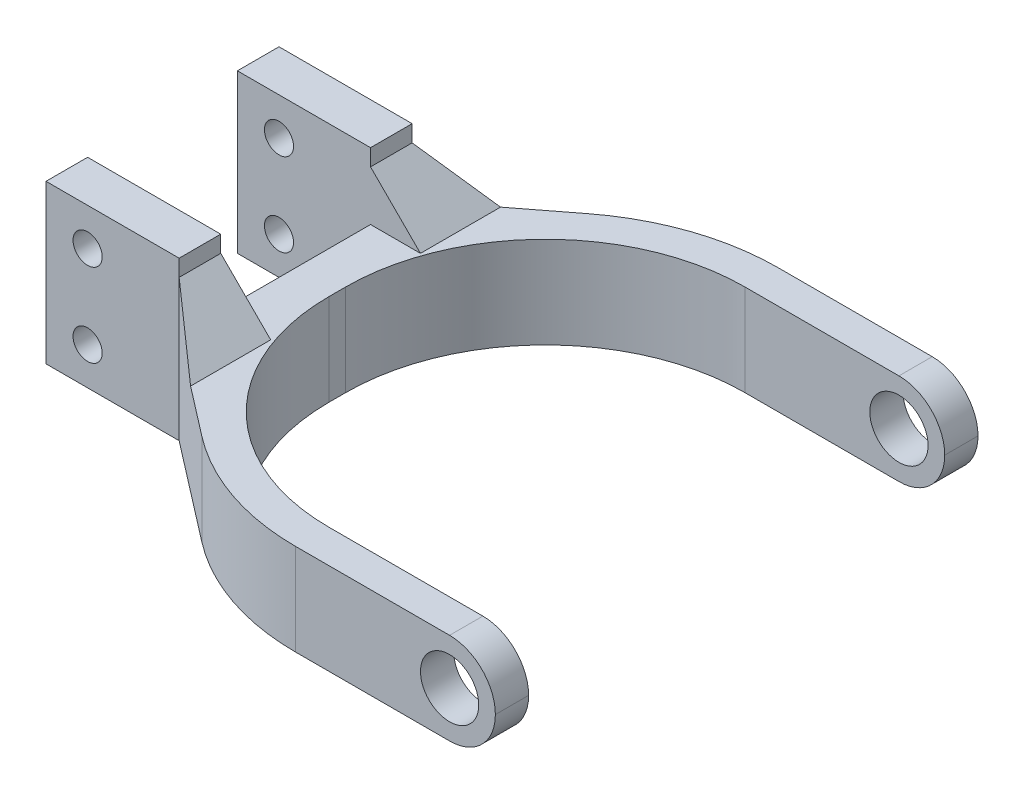
ISO-10303-21;
HEADER;
FILE_DESCRIPTION(('STEP AP214'),'2;1');
FILE_NAME('part.step','',(''),(''),'','','');
FILE_SCHEMA(('AUTOMOTIVE_DESIGN { 1 0 10303 214 1 1 1 1 }'));
ENDSEC;
DATA;
#1=APPLICATION_CONTEXT('core data for automotive mechanical design processes');
#2=APPLICATION_PROTOCOL_DEFINITION('international standard','automotive_design',2000,#1);
#3=PRODUCT_CONTEXT('',#1,'mechanical');
#4=PRODUCT('Part','Part','',(#3));
#5=PRODUCT_RELATED_PRODUCT_CATEGORY('part','',(#4));
#6=PRODUCT_DEFINITION_FORMATION('','',#4);
#7=PRODUCT_DEFINITION_CONTEXT('part definition',#1,'design');
#8=PRODUCT_DEFINITION('design','',#6,#7);
#9=PRODUCT_DEFINITION_SHAPE('','',#8);
#10=(LENGTH_UNIT() NAMED_UNIT(*) SI_UNIT(.MILLI.,.METRE.));
#11=(NAMED_UNIT(*) PLANE_ANGLE_UNIT() SI_UNIT($,.RADIAN.));
#12=(NAMED_UNIT(*) SI_UNIT($,.STERADIAN.) SOLID_ANGLE_UNIT());
#13=UNCERTAINTY_MEASURE_WITH_UNIT(LENGTH_MEASURE(1.E-05),#10,'distance_accuracy_value','');
#14=(GEOMETRIC_REPRESENTATION_CONTEXT(3) GLOBAL_UNCERTAINTY_ASSIGNED_CONTEXT((#13)) GLOBAL_UNIT_ASSIGNED_CONTEXT((#10,
#11,#12)) REPRESENTATION_CONTEXT('',''));
#15=CARTESIAN_POINT('',(0.,0.,0.));
#16=DIRECTION('',(0.,0.,1.));
#17=DIRECTION('',(1.,0.,0.));
#18=AXIS2_PLACEMENT_3D('',#15,#16,#17);
#19=CARTESIAN_POINT('',(29.,5.5,0.999999999999998));
#20=DIRECTION('',(0.,1.,0.));
#21=DIRECTION('',(0.,0.,1.));
#22=AXIS2_PLACEMENT_3D('',#19,#20,#21);
#23=PLANE('',#22);
#24=DIRECTION('',(-0.792045143537439,0.,0.610462521862527));
#25=VECTOR('',#24,1.);
#26=CARTESIAN_POINT('',(0.,5.5,-14.));
#27=LINE('',#26,#25);
#28=CARTESIAN_POINT('',(11.9070493878492,5.5,-23.1772640190483));
#29=VERTEX_POINT('',#28);
#30=CARTESIAN_POINT('',(5.99999999999998,5.5,-18.6244524836254));
#31=VERTEX_POINT('',#30);
#32=EDGE_CURVE('E117',#29,#31,#27,.T.);
#33=ORIENTED_EDGE('',*,*,#32,.T.);
#34=DIRECTION('',(0.,0.,1.));
#35=VECTOR('',#34,1.);
#36=CARTESIAN_POINT('',(5.99999999999998,5.5,0.999999999999998));
#37=LINE('',#36,#35);
#38=CARTESIAN_POINT('',(5.99999999999998,5.5,-9.00000000000002));
#39=VERTEX_POINT('',#38);
#40=EDGE_CURVE('E111',#31,#39,#37,.T.);
#41=ORIENTED_EDGE('',*,*,#40,.T.);
#42=DIRECTION('',(-1.,0.,0.));
#43=VECTOR('',#42,1.);
#44=CARTESIAN_POINT('',(29.,5.5,-9.00000000000006));
#45=LINE('',#44,#43);
#46=CARTESIAN_POINT('',(0.,5.5,-9.00000000000002));
#47=VERTEX_POINT('',#46);
#48=EDGE_CURVE('E98',#39,#47,#45,.T.);
#49=ORIENTED_EDGE('',*,*,#48,.T.);
#50=DIRECTION('',(0.,0.,1.));
#51=VECTOR('',#50,1.);
#52=CARTESIAN_POINT('',(0.,5.5,-9.00000000000002));
#53=LINE('',#52,#51);
#54=CARTESIAN_POINT('',(0.,5.5,9.00000000000001));
#55=VERTEX_POINT('',#54);
#56=EDGE_CURVE('E229',#47,#55,#53,.T.);
#57=ORIENTED_EDGE('',*,*,#56,.T.);
#58=DIRECTION('',(1.,0.,0.));
#59=VECTOR('',#58,1.);
#60=CARTESIAN_POINT('',(29.,5.5,9.00000000000002));
#61=LINE('',#60,#59);
#62=CARTESIAN_POINT('',(5.99999999999998,5.5,9.00000000000001));
#63=VERTEX_POINT('',#62);
#64=EDGE_CURVE('E56',#55,#63,#61,.T.);
#65=ORIENTED_EDGE('',*,*,#64,.T.);
#66=DIRECTION('',(0.,0.,1.));
#67=VECTOR('',#66,1.);
#68=CARTESIAN_POINT('',(5.99999999999998,5.5,0.999999999999998));
#69=LINE('',#68,#67);
#70=CARTESIAN_POINT('',(5.99999999999998,5.5,18.6244524836254));
#71=VERTEX_POINT('',#70);
#72=EDGE_CURVE('E132',#63,#71,#69,.T.);
#73=ORIENTED_EDGE('',*,*,#72,.T.);
#74=DIRECTION('',(0.79204514353744,0.,0.610462521862527));
#75=VECTOR('',#74,1.);
#76=CARTESIAN_POINT('',(0.,5.5,14.));
#77=LINE('',#76,#75);
#78=CARTESIAN_POINT('',(11.9070493878492,5.5,23.1772640190483));
#79=VERTEX_POINT('',#78);
#80=EDGE_CURVE('E303',#71,#79,#77,.T.);
#81=ORIENTED_EDGE('',*,*,#80,.T.);
#82=CARTESIAN_POINT('',(29.,5.5,0.999999999999998));
#83=DIRECTION('',(0.,1.,0.));
#84=DIRECTION('',(0.,0.,1.));
#85=AXIS2_PLACEMENT_3D('',#82,#83,#84);
#86=CIRCLE('',#85,28.);
#87=CARTESIAN_POINT('',(29.,5.5,29.));
#88=VERTEX_POINT('',#87);
#89=EDGE_CURVE('E300',#79,#88,#86,.T.);
#90=ORIENTED_EDGE('',*,*,#89,.T.);
#91=DIRECTION('',(1.,0.,0.));
#92=VECTOR('',#91,1.);
#93=CARTESIAN_POINT('',(29.,5.5,29.));
#94=LINE('',#93,#92);
#95=CARTESIAN_POINT('',(47.5,5.5,29.));
#96=VERTEX_POINT('',#95);
#97=EDGE_CURVE('E297',#88,#96,#94,.T.);
#98=ORIENTED_EDGE('',*,*,#97,.T.);
#99=DIRECTION('',(0.,0.,-1.));
#100=VECTOR('',#99,1.);
#101=CARTESIAN_POINT('',(47.5,5.5,25.));
#102=LINE('',#101,#100);
#103=CARTESIAN_POINT('',(47.5,5.5,25.));
#104=VERTEX_POINT('',#103);
#105=EDGE_CURVE('E161',#96,#104,#102,.T.);
#106=ORIENTED_EDGE('',*,*,#105,.T.);
#107=DIRECTION('',(-1.,0.,0.));
#108=VECTOR('',#107,1.);
#109=CARTESIAN_POINT('',(53.,5.5,25.));
#110=LINE('',#109,#108);
#111=CARTESIAN_POINT('',(29.,5.5,25.));
#112=VERTEX_POINT('',#111);
#113=EDGE_CURVE('E294',#104,#112,#110,.T.);
#114=ORIENTED_EDGE('',*,*,#113,.T.);
#115=CARTESIAN_POINT('',(29.,5.5,0.999999999999998));
#116=DIRECTION('',(0.,-1.,0.));
#117=DIRECTION('',(0.,0.,-1.));
#118=AXIS2_PLACEMENT_3D('',#115,#116,#117);
#119=CIRCLE('',#118,24.);
#120=CARTESIAN_POINT('',(5.,5.5,1.));
#121=VERTEX_POINT('',#120);
#122=EDGE_CURVE('E291',#112,#121,#119,.T.);
#123=ORIENTED_EDGE('',*,*,#122,.T.);
#124=DIRECTION('',(0.,0.,-1.));
#125=VECTOR('',#124,1.);
#126=CARTESIAN_POINT('',(5.,5.5,-1.));
#127=LINE('',#126,#125);
#128=CARTESIAN_POINT('',(5.,5.5,-1.00000000000001));
#129=VERTEX_POINT('',#128);
#130=EDGE_CURVE('E288',#121,#129,#127,.T.);
#131=ORIENTED_EDGE('',*,*,#130,.T.);
#132=CARTESIAN_POINT('',(29.,5.5,-1.));
#133=DIRECTION('',(0.,-1.,0.));
#134=DIRECTION('',(0.,0.,1.));
#135=AXIS2_PLACEMENT_3D('',#132,#133,#134);
#136=CIRCLE('',#135,24.);
#137=CARTESIAN_POINT('',(29.,5.5,-25.));
#138=VERTEX_POINT('',#137);
#139=EDGE_CURVE('E285',#129,#138,#136,.T.);
#140=ORIENTED_EDGE('',*,*,#139,.T.);
#141=DIRECTION('',(1.,0.,0.));
#142=VECTOR('',#141,1.);
#143=CARTESIAN_POINT('',(53.,5.5,-25.));
#144=LINE('',#143,#142);
#145=CARTESIAN_POINT('',(47.5,5.5,-25.));
#146=VERTEX_POINT('',#145);
#147=EDGE_CURVE('E282',#138,#146,#144,.T.);
#148=ORIENTED_EDGE('',*,*,#147,.T.);
#149=DIRECTION('',(0.,0.,-1.));
#150=VECTOR('',#149,1.);
#151=CARTESIAN_POINT('',(47.5,5.5,-29.));
#152=LINE('',#151,#150);
#153=CARTESIAN_POINT('',(47.5,5.5,-29.));
#154=VERTEX_POINT('',#153);
#155=EDGE_CURVE('E164',#146,#154,#152,.T.);
#156=ORIENTED_EDGE('',*,*,#155,.T.);
#157=DIRECTION('',(-1.,0.,0.));
#158=VECTOR('',#157,1.);
#159=CARTESIAN_POINT('',(29.,5.5,-29.));
#160=LINE('',#159,#158);
#161=CARTESIAN_POINT('',(29.,5.5,-29.));
#162=VERTEX_POINT('',#161);
#163=EDGE_CURVE('E279',#154,#162,#160,.T.);
#164=ORIENTED_EDGE('',*,*,#163,.T.);
#165=CARTESIAN_POINT('',(29.,5.5,-1.));
#166=DIRECTION('',(0.,1.,0.));
#167=DIRECTION('',(0.,0.,1.));
#168=AXIS2_PLACEMENT_3D('',#165,#166,#167);
#169=CIRCLE('',#168,28.);
#170=EDGE_CURVE('E277',#162,#29,#169,.T.);
#171=ORIENTED_EDGE('',*,*,#170,.T.);
#172=EDGE_LOOP('',(#33,#41,#49,#57,#65,#73,#81,#90,#98,#106,#114,#123,#131,#140,#148,#156,#164,#171));
#173=FACE_BOUND('',#172,.T.);
#174=ADVANCED_FACE('F32',(#173),#23,.T.);
#175=CARTESIAN_POINT('',(-16.,5.5,-9.));
#176=DIRECTION('',(0.,0.,-1.));
#177=DIRECTION('',(-1.,0.,0.));
#178=AXIS2_PLACEMENT_3D('',#175,#176,#177);
#179=PLANE('',#178);
#180=CARTESIAN_POINT('',(-11.,-0.999999999999999,-9.));
#181=DIRECTION('',(0.,0.,-1.));
#182=DIRECTION('',(-1.,0.,0.));
#183=AXIS2_PLACEMENT_3D('',#180,#181,#182);
#184=CIRCLE('',#183,1.75);
#185=CARTESIAN_POINT('',(-12.75,-0.999999999999999,-9.));
#186=VERTEX_POINT('',#185);
#187=EDGE_CURVE('E359',#186,#186,#184,.T.);
#188=ORIENTED_EDGE('',*,*,#187,.T.);
#189=EDGE_LOOP('',(#188));
#190=FACE_BOUND('',#189,.T.);
#191=CARTESIAN_POINT('',(-11.,9.,-9.));
#192=DIRECTION('',(0.,0.,-1.));
#193=DIRECTION('',(-1.,0.,0.));
#194=AXIS2_PLACEMENT_3D('',#191,#192,#193);
#195=CIRCLE('',#194,1.75);
#196=CARTESIAN_POINT('',(-12.75,9.,-9.));
#197=VERTEX_POINT('',#196);
#198=EDGE_CURVE('E352',#197,#197,#195,.T.);
#199=ORIENTED_EDGE('',*,*,#198,.T.);
#200=EDGE_LOOP('',(#199));
#201=FACE_BOUND('',#200,.T.);
#202=DIRECTION('',(1.,0.,0.));
#203=VECTOR('',#202,1.);
#204=CARTESIAN_POINT('',(-16.,-5.5,-9.));
#205=LINE('',#204,#203);
#206=CARTESIAN_POINT('',(-16.,-5.5,-9.));
#207=VERTEX_POINT('',#206);
#208=CARTESIAN_POINT('',(0.,-5.5,-9.00000000000002));
#209=VERTEX_POINT('',#208);
#210=EDGE_CURVE('E152',#207,#209,#205,.T.);
#211=ORIENTED_EDGE('',*,*,#210,.T.);
#212=DIRECTION('',(0.,-1.,0.));
#213=VECTOR('',#212,1.);
#214=CARTESIAN_POINT('',(0.,5.5,-9.00000000000002));
#215=LINE('',#214,#213);
#216=EDGE_CURVE('E108',#47,#209,#215,.T.);
#217=ORIENTED_EDGE('',*,*,#216,.F.);
#218=ORIENTED_EDGE('',*,*,#48,.F.);
#219=DIRECTION('',(-0.707106781186544,0.707106781186551,0.));
#220=VECTOR('',#219,1.);
#221=CARTESIAN_POINT('',(-4.99999999999991,16.5,-9.00000000000001));
#222=LINE('',#221,#220);
#223=CARTESIAN_POINT('',(0.,11.5,-9.00000000000002));
#224=VERTEX_POINT('',#223);
#225=EDGE_CURVE('E104',#39,#224,#222,.T.);
#226=ORIENTED_EDGE('',*,*,#225,.T.);
#227=DIRECTION('',(0.,-1.,0.));
#228=VECTOR('',#227,1.);
#229=CARTESIAN_POINT('',(0.,13.5,-9.00000000000002));
#230=LINE('',#229,#228);
#231=CARTESIAN_POINT('',(0.,13.5,-9.00000000000002));
#232=VERTEX_POINT('',#231);
#233=EDGE_CURVE('E316',#232,#224,#230,.T.);
#234=ORIENTED_EDGE('',*,*,#233,.F.);
#235=DIRECTION('',(1.,0.,0.));
#236=VECTOR('',#235,1.);
#237=CARTESIAN_POINT('',(-16.,13.5,-9.00000000000002));
#238=LINE('',#237,#236);
#239=CARTESIAN_POINT('',(-16.,13.5,-9.00000000000002));
#240=VERTEX_POINT('',#239);
#241=EDGE_CURVE('E329',#240,#232,#238,.T.);
#242=ORIENTED_EDGE('',*,*,#241,.F.);
#243=DIRECTION('',(0.,-1.,0.));
#244=VECTOR('',#243,1.);
#245=CARTESIAN_POINT('',(-16.,5.5,-9.));
#246=LINE('',#245,#244);
#247=EDGE_CURVE('E223',#240,#207,#246,.T.);
#248=ORIENTED_EDGE('',*,*,#247,.T.);
#249=EDGE_LOOP('',(#211,#217,#218,#226,#234,#242,#248));
#250=FACE_BOUND('',#249,.T.);
#251=ADVANCED_FACE('F101',(#190,#201,#250),#179,.F.);
#252=CARTESIAN_POINT('',(0.,5.5,-9.00000000000002));
#253=DIRECTION('',(1.,0.,0.));
#254=DIRECTION('',(0.,0.,-1.));
#255=AXIS2_PLACEMENT_3D('',#252,#253,#254);
#256=PLANE('',#255);
#257=DIRECTION('',(0.,0.,1.));
#258=VECTOR('',#257,1.);
#259=CARTESIAN_POINT('',(0.,-5.5,-9.00000000000002));
#260=LINE('',#259,#258);
#261=CARTESIAN_POINT('',(0.,-5.5,9.00000000000001));
#262=VERTEX_POINT('',#261);
#263=EDGE_CURVE('E272',#209,#262,#260,.T.);
#264=ORIENTED_EDGE('',*,*,#263,.T.);
#265=DIRECTION('',(0.,-1.,0.));
#266=VECTOR('',#265,1.);
#267=CARTESIAN_POINT('',(0.,5.5,9.00000000000001));
#268=LINE('',#267,#266);
#269=EDGE_CURVE('E186',#55,#262,#268,.T.);
#270=ORIENTED_EDGE('',*,*,#269,.F.);
#271=ORIENTED_EDGE('',*,*,#56,.F.);
#272=ORIENTED_EDGE('',*,*,#216,.T.);
#273=EDGE_LOOP('',(#264,#270,#271,#272));
#274=FACE_BOUND('',#273,.T.);
#275=ADVANCED_FACE('F533',(#274),#256,.F.);
#276=CARTESIAN_POINT('',(-16.,5.5,9.));
#277=DIRECTION('',(0.,0.,1.));
#278=DIRECTION('',(1.,0.,0.));
#279=AXIS2_PLACEMENT_3D('',#276,#277,#278);
#280=PLANE('',#279);
#281=CARTESIAN_POINT('',(-11.,-0.999999999999999,9.));
#282=DIRECTION('',(0.,0.,1.));
#283=DIRECTION('',(1.,0.,0.));
#284=AXIS2_PLACEMENT_3D('',#281,#282,#283);
#285=CIRCLE('',#284,1.75);
#286=CARTESIAN_POINT('',(-9.25,-0.999999999999999,9.));
#287=VERTEX_POINT('',#286);
#288=EDGE_CURVE('E138',#287,#287,#285,.T.);
#289=ORIENTED_EDGE('',*,*,#288,.T.);
#290=EDGE_LOOP('',(#289));
#291=FACE_BOUND('',#290,.T.);
#292=CARTESIAN_POINT('',(-11.,9.,9.));
#293=DIRECTION('',(0.,0.,1.));
#294=DIRECTION('',(1.,0.,0.));
#295=AXIS2_PLACEMENT_3D('',#292,#293,#294);
#296=CIRCLE('',#295,1.75);
#297=CARTESIAN_POINT('',(-9.25,9.,9.));
#298=VERTEX_POINT('',#297);
#299=EDGE_CURVE('E143',#298,#298,#296,.T.);
#300=ORIENTED_EDGE('',*,*,#299,.T.);
#301=EDGE_LOOP('',(#300));
#302=FACE_BOUND('',#301,.T.);
#303=DIRECTION('',(-1.,0.,0.));
#304=VECTOR('',#303,1.);
#305=CARTESIAN_POINT('',(-16.,-5.5,9.));
#306=LINE('',#305,#304);
#307=CARTESIAN_POINT('',(-16.,-5.5,9.));
#308=VERTEX_POINT('',#307);
#309=EDGE_CURVE('E269',#262,#308,#306,.T.);
#310=ORIENTED_EDGE('',*,*,#309,.T.);
#311=DIRECTION('',(0.,-1.,0.));
#312=VECTOR('',#311,1.);
#313=CARTESIAN_POINT('',(-16.,5.5,9.));
#314=LINE('',#313,#312);
#315=CARTESIAN_POINT('',(-16.,13.5,9.));
#316=VERTEX_POINT('',#315);
#317=EDGE_CURVE('E188',#316,#308,#314,.T.);
#318=ORIENTED_EDGE('',*,*,#317,.F.);
#319=DIRECTION('',(-1.,0.,0.));
#320=VECTOR('',#319,1.);
#321=CARTESIAN_POINT('',(-16.,13.5,9.));
#322=LINE('',#321,#320);
#323=CARTESIAN_POINT('',(0.,13.5,9.));
#324=VERTEX_POINT('',#323);
#325=EDGE_CURVE('E340',#324,#316,#322,.T.);
#326=ORIENTED_EDGE('',*,*,#325,.F.);
#327=DIRECTION('',(0.,-1.,0.));
#328=VECTOR('',#327,1.);
#329=CARTESIAN_POINT('',(0.,13.5,9.));
#330=LINE('',#329,#328);
#331=CARTESIAN_POINT('',(0.,11.5,9.));
#332=VERTEX_POINT('',#331);
#333=EDGE_CURVE('E337',#324,#332,#330,.T.);
#334=ORIENTED_EDGE('',*,*,#333,.T.);
#335=DIRECTION('',(0.707106781186544,-0.707106781186551,0.));
#336=VECTOR('',#335,1.);
#337=CARTESIAN_POINT('',(-4.99999999999991,16.5,9.00000000000001));
#338=LINE('',#337,#336);
#339=EDGE_CURVE('E40',#332,#63,#338,.T.);
#340=ORIENTED_EDGE('',*,*,#339,.T.);
#341=ORIENTED_EDGE('',*,*,#64,.F.);
#342=ORIENTED_EDGE('',*,*,#269,.T.);
#343=EDGE_LOOP('',(#310,#318,#326,#334,#340,#341,#342));
#344=FACE_BOUND('',#343,.T.);
#345=ADVANCED_FACE('F734',(#291,#302,#344),#280,.F.);
#346=CARTESIAN_POINT('',(-16.,5.5,9.));
#347=DIRECTION('',(1.,0.,0.));
#348=DIRECTION('',(0.,0.,-1.));
#349=AXIS2_PLACEMENT_3D('',#346,#347,#348);
#350=PLANE('',#349);
#351=DIRECTION('',(0.,0.,1.));
#352=VECTOR('',#351,1.);
#353=CARTESIAN_POINT('',(-16.,-5.5,9.));
#354=LINE('',#353,#352);
#355=CARTESIAN_POINT('',(-16.,-5.5,14.));
#356=VERTEX_POINT('',#355);
#357=EDGE_CURVE('E266',#308,#356,#354,.T.);
#358=ORIENTED_EDGE('',*,*,#357,.T.);
#359=DIRECTION('',(0.,-1.,0.));
#360=VECTOR('',#359,1.);
#361=CARTESIAN_POINT('',(-16.,5.5,14.));
#362=LINE('',#361,#360);
#363=CARTESIAN_POINT('',(-16.,13.5,14.));
#364=VERTEX_POINT('',#363);
#365=EDGE_CURVE('E191',#364,#356,#362,.T.);
#366=ORIENTED_EDGE('',*,*,#365,.F.);
#367=DIRECTION('',(0.,0.,1.));
#368=VECTOR('',#367,1.);
#369=CARTESIAN_POINT('',(-16.,13.5,9.));
#370=LINE('',#369,#368);
#371=EDGE_CURVE('E349',#316,#364,#370,.T.);
#372=ORIENTED_EDGE('',*,*,#371,.F.);
#373=ORIENTED_EDGE('',*,*,#317,.T.);
#374=EDGE_LOOP('',(#358,#366,#372,#373));
#375=FACE_BOUND('',#374,.T.);
#376=ADVANCED_FACE('F374',(#375),#350,.F.);
#377=CARTESIAN_POINT('',(-16.,5.5,14.));
#378=DIRECTION('',(0.,0.,-1.));
#379=DIRECTION('',(-1.,0.,0.));
#380=AXIS2_PLACEMENT_3D('',#377,#378,#379);
#381=PLANE('',#380);
#382=CARTESIAN_POINT('',(-11.,-0.999999999999999,14.));
#383=DIRECTION('',(0.,0.,1.));
#384=DIRECTION('',(1.,0.,0.));
#385=AXIS2_PLACEMENT_3D('',#382,#383,#384);
#386=CIRCLE('',#385,1.75);
#387=CARTESIAN_POINT('',(-9.25,-0.999999999999999,14.));
#388=VERTEX_POINT('',#387);
#389=EDGE_CURVE('E139',#388,#388,#386,.T.);
#390=ORIENTED_EDGE('',*,*,#389,.F.);
#391=EDGE_LOOP('',(#390));
#392=FACE_BOUND('',#391,.T.);
#393=CARTESIAN_POINT('',(-11.,9.,14.));
#394=DIRECTION('',(0.,0.,1.));
#395=DIRECTION('',(1.,0.,0.));
#396=AXIS2_PLACEMENT_3D('',#393,#394,#395);
#397=CIRCLE('',#396,1.75);
#398=CARTESIAN_POINT('',(-9.25,9.,14.));
#399=VERTEX_POINT('',#398);
#400=EDGE_CURVE('E144',#399,#399,#397,.T.);
#401=ORIENTED_EDGE('',*,*,#400,.F.);
#402=EDGE_LOOP('',(#401));
#403=FACE_BOUND('',#402,.T.);
#404=DIRECTION('',(1.,0.,0.));
#405=VECTOR('',#404,1.);
#406=CARTESIAN_POINT('',(-16.,-5.5,14.));
#407=LINE('',#406,#405);
#408=CARTESIAN_POINT('',(0.,-5.5,14.));
#409=VERTEX_POINT('',#408);
#410=EDGE_CURVE('E264',#356,#409,#407,.T.);
#411=ORIENTED_EDGE('',*,*,#410,.T.);
#412=DIRECTION('',(0.,-1.,0.));
#413=VECTOR('',#412,1.);
#414=CARTESIAN_POINT('',(0.,5.5,14.));
#415=LINE('',#414,#413);
#416=CARTESIAN_POINT('',(0.,11.5,14.));
#417=VERTEX_POINT('',#416);
#418=EDGE_CURVE('E47',#417,#409,#415,.T.);
#419=ORIENTED_EDGE('',*,*,#418,.F.);
#420=DIRECTION('',(0.,-1.,0.));
#421=VECTOR('',#420,1.);
#422=CARTESIAN_POINT('',(0.,13.5,14.));
#423=LINE('',#422,#421);
#424=CARTESIAN_POINT('',(0.,13.5,14.));
#425=VERTEX_POINT('',#424);
#426=EDGE_CURVE('E335',#425,#417,#423,.T.);
#427=ORIENTED_EDGE('',*,*,#426,.F.);
#428=DIRECTION('',(1.,0.,0.));
#429=VECTOR('',#428,1.);
#430=CARTESIAN_POINT('',(-16.,13.5,14.));
#431=LINE('',#430,#429);
#432=EDGE_CURVE('E346',#364,#425,#431,.T.);
#433=ORIENTED_EDGE('',*,*,#432,.F.);
#434=ORIENTED_EDGE('',*,*,#365,.T.);
#435=EDGE_LOOP('',(#411,#419,#427,#433,#434));
#436=FACE_BOUND('',#435,.T.);
#437=ADVANCED_FACE('F370',(#392,#403,#436),#381,.F.);
#438=CARTESIAN_POINT('',(0.,5.5,14.));
#439=DIRECTION('',(0.610462521862527,0.,-0.79204514353744));
#440=DIRECTION('',(-0.79204514353744,0.,-0.610462521862527));
#441=AXIS2_PLACEMENT_3D('',#438,#439,#440);
#442=PLANE('',#441);
#443=DIRECTION('',(0.79204514353744,0.,0.610462521862527));
#444=VECTOR('',#443,1.);
#445=CARTESIAN_POINT('',(0.,-5.5,14.));
#446=LINE('',#445,#444);
#447=CARTESIAN_POINT('',(11.9070493878492,-5.5,23.1772640190483));
#448=VERTEX_POINT('',#447);
#449=EDGE_CURVE('E261',#409,#448,#446,.T.);
#450=ORIENTED_EDGE('',*,*,#449,.T.);
#451=DIRECTION('',(0.,-1.,0.));
#452=VECTOR('',#451,1.);
#453=CARTESIAN_POINT('',(11.9070493878492,5.5,23.1772640190483));
#454=LINE('',#453,#452);
#455=EDGE_CURVE('E195',#79,#448,#454,.T.);
#456=ORIENTED_EDGE('',*,*,#455,.F.);
#457=ORIENTED_EDGE('',*,*,#80,.F.);
#458=DIRECTION('',(-0.620885310291316,0.620885310291322,-0.478542435870536));
#459=VECTOR('',#458,1.);
#460=CARTESIAN_POINT('',(2.3129914112133,9.18700858878671,15.7827198126983));
#461=LINE('',#460,#459);
#462=EDGE_CURVE('E11',#71,#417,#461,.T.);
#463=ORIENTED_EDGE('',*,*,#462,.T.);
#464=ORIENTED_EDGE('',*,*,#418,.T.);
#465=EDGE_LOOP('',(#450,#456,#457,#463,#464));
#466=FACE_BOUND('',#465,.T.);
#467=ADVANCED_FACE('F373',(#466),#442,.F.);
#468=CARTESIAN_POINT('',(29.,5.5,0.999999999999998));
#469=DIRECTION('',(0.,-1.,0.));
#470=DIRECTION('',(0.,0.,-1.));
#471=AXIS2_PLACEMENT_3D('',#468,#469,#470);
#472=CYLINDRICAL_SURFACE('',#471,28.);
#473=CARTESIAN_POINT('',(29.,-5.5,0.999999999999998));
#474=DIRECTION('',(0.,1.,0.));
#475=DIRECTION('',(0.,0.,1.));
#476=AXIS2_PLACEMENT_3D('',#473,#474,#475);
#477=CIRCLE('',#476,28.);
#478=CARTESIAN_POINT('',(29.,-5.5,29.));
#479=VERTEX_POINT('',#478);
#480=EDGE_CURVE('E258',#448,#479,#477,.T.);
#481=ORIENTED_EDGE('',*,*,#480,.T.);
#482=DIRECTION('',(0.,-1.,0.));
#483=VECTOR('',#482,1.);
#484=CARTESIAN_POINT('',(29.,5.5,29.));
#485=LINE('',#484,#483);
#486=EDGE_CURVE('E198',#88,#479,#485,.T.);
#487=ORIENTED_EDGE('',*,*,#486,.F.);
#488=ORIENTED_EDGE('',*,*,#89,.F.);
#489=ORIENTED_EDGE('',*,*,#455,.T.);
#490=EDGE_LOOP('',(#481,#487,#488,#489));
#491=FACE_BOUND('',#490,.T.);
#492=ADVANCED_FACE('F400',(#491),#472,.T.);
#493=CARTESIAN_POINT('',(29.,5.5,29.));
#494=DIRECTION('',(0.,0.,-1.));
#495=DIRECTION('',(-1.,0.,0.));
#496=AXIS2_PLACEMENT_3D('',#493,#494,#495);
#497=PLANE('',#496);
#498=CARTESIAN_POINT('',(47.5,0.,29.));
#499=DIRECTION('',(0.,0.,1.));
#500=DIRECTION('',(1.,0.,0.));
#501=AXIS2_PLACEMENT_3D('',#498,#499,#500);
#502=CIRCLE('',#501,3.5);
#503=CARTESIAN_POINT('',(51.,0.,29.));
#504=VERTEX_POINT('',#503);
#505=EDGE_CURVE('E313',#504,#504,#502,.T.);
#506=ORIENTED_EDGE('',*,*,#505,.F.);
#507=EDGE_LOOP('',(#506));
#508=FACE_BOUND('',#507,.T.);
#509=DIRECTION('',(1.,0.,0.));
#510=VECTOR('',#509,1.);
#511=CARTESIAN_POINT('',(29.,-5.5,29.));
#512=LINE('',#511,#510);
#513=CARTESIAN_POINT('',(47.5,-5.5,29.));
#514=VERTEX_POINT('',#513);
#515=EDGE_CURVE('E255',#479,#514,#512,.T.);
#516=ORIENTED_EDGE('',*,*,#515,.T.);
#517=CARTESIAN_POINT('',(47.5,0.,29.));
#518=DIRECTION('',(0.,0.,-1.));
#519=DIRECTION('',(-1.,0.,0.));
#520=AXIS2_PLACEMENT_3D('',#517,#518,#519);
#521=CIRCLE('',#520,5.5);
#522=CARTESIAN_POINT('',(53.,0.,29.));
#523=VERTEX_POINT('',#522);
#524=EDGE_CURVE('E167',#514,#523,#521,.F.);
#525=ORIENTED_EDGE('',*,*,#524,.T.);
#526=CARTESIAN_POINT('',(47.5,0.,29.));
#527=DIRECTION('',(0.,0.,-1.));
#528=DIRECTION('',(-1.,0.,0.));
#529=AXIS2_PLACEMENT_3D('',#526,#527,#528);
#530=CIRCLE('',#529,5.5);
#531=EDGE_CURVE('E170',#523,#96,#530,.F.);
#532=ORIENTED_EDGE('',*,*,#531,.T.);
#533=ORIENTED_EDGE('',*,*,#97,.F.);
#534=ORIENTED_EDGE('',*,*,#486,.T.);
#535=EDGE_LOOP('',(#516,#525,#532,#533,#534));
#536=FACE_BOUND('',#535,.T.);
#537=ADVANCED_FACE('F407',(#508,#536),#497,.F.);
#538=CARTESIAN_POINT('',(53.,5.5,25.));
#539=DIRECTION('',(0.,0.,1.));
#540=DIRECTION('',(1.,0.,0.));
#541=AXIS2_PLACEMENT_3D('',#538,#539,#540);
#542=PLANE('',#541);
#543=CARTESIAN_POINT('',(47.5,0.,25.));
#544=DIRECTION('',(0.,0.,1.));
#545=DIRECTION('',(1.,0.,0.));
#546=AXIS2_PLACEMENT_3D('',#543,#544,#545);
#547=CIRCLE('',#546,3.5);
#548=CARTESIAN_POINT('',(51.,0.,25.));
#549=VERTEX_POINT('',#548);
#550=EDGE_CURVE('E149',#549,#549,#547,.T.);
#551=ORIENTED_EDGE('',*,*,#550,.T.);
#552=EDGE_LOOP('',(#551));
#553=FACE_BOUND('',#552,.T.);
#554=CARTESIAN_POINT('',(47.5,0.,25.));
#555=DIRECTION('',(0.,0.,1.));
#556=DIRECTION('',(1.,0.,0.));
#557=AXIS2_PLACEMENT_3D('',#554,#555,#556);
#558=CIRCLE('',#557,5.5);
#559=CARTESIAN_POINT('',(53.,0.,25.));
#560=VERTEX_POINT('',#559);
#561=EDGE_CURVE('E182',#104,#560,#558,.F.);
#562=ORIENTED_EDGE('',*,*,#561,.T.);
#563=CARTESIAN_POINT('',(47.5,0.,25.));
#564=DIRECTION('',(0.,0.,1.));
#565=DIRECTION('',(1.,0.,0.));
#566=AXIS2_PLACEMENT_3D('',#563,#564,#565);
#567=CIRCLE('',#566,5.5);
#568=CARTESIAN_POINT('',(47.5,-5.5,25.));
#569=VERTEX_POINT('',#568);
#570=EDGE_CURVE('E179',#560,#569,#567,.F.);
#571=ORIENTED_EDGE('',*,*,#570,.T.);
#572=DIRECTION('',(-1.,0.,0.));
#573=VECTOR('',#572,1.);
#574=CARTESIAN_POINT('',(53.,-5.5,25.));
#575=LINE('',#574,#573);
#576=CARTESIAN_POINT('',(29.,-5.5,25.));
#577=VERTEX_POINT('',#576);
#578=EDGE_CURVE('E252',#569,#577,#575,.T.);
#579=ORIENTED_EDGE('',*,*,#578,.T.);
#580=DIRECTION('',(0.,-1.,0.));
#581=VECTOR('',#580,1.);
#582=CARTESIAN_POINT('',(29.,5.5,25.));
#583=LINE('',#582,#581);
#584=EDGE_CURVE('E201',#112,#577,#583,.T.);
#585=ORIENTED_EDGE('',*,*,#584,.F.);
#586=ORIENTED_EDGE('',*,*,#113,.F.);
#587=EDGE_LOOP('',(#562,#571,#579,#585,#586));
#588=FACE_BOUND('',#587,.T.);
#589=ADVANCED_FACE('F429',(#553,#588),#542,.F.);
#590=CARTESIAN_POINT('',(29.,5.5,0.999999999999998));
#591=DIRECTION('',(0.,-1.,0.));
#592=DIRECTION('',(0.,0.,-1.));
#593=AXIS2_PLACEMENT_3D('',#590,#591,#592);
#594=CYLINDRICAL_SURFACE('',#593,24.);
#595=CARTESIAN_POINT('',(29.,-5.5,0.999999999999998));
#596=DIRECTION('',(0.,-1.,0.));
#597=DIRECTION('',(0.,0.,-1.));
#598=AXIS2_PLACEMENT_3D('',#595,#596,#597);
#599=CIRCLE('',#598,24.);
#600=CARTESIAN_POINT('',(5.,-5.5,1.));
#601=VERTEX_POINT('',#600);
#602=EDGE_CURVE('E249',#577,#601,#599,.T.);
#603=ORIENTED_EDGE('',*,*,#602,.T.);
#604=DIRECTION('',(0.,-1.,0.));
#605=VECTOR('',#604,1.);
#606=CARTESIAN_POINT('',(5.,5.5,1.));
#607=LINE('',#606,#605);
#608=EDGE_CURVE('E204',#121,#601,#607,.T.);
#609=ORIENTED_EDGE('',*,*,#608,.F.);
#610=ORIENTED_EDGE('',*,*,#122,.F.);
#611=ORIENTED_EDGE('',*,*,#584,.T.);
#612=EDGE_LOOP('',(#603,#609,#610,#611));
#613=FACE_BOUND('',#612,.T.);
#614=ADVANCED_FACE('F806',(#613),#594,.F.);
#615=CARTESIAN_POINT('',(5.,5.5,-1.));
#616=DIRECTION('',(-1.,0.,0.));
#617=DIRECTION('',(0.,0.,1.));
#618=AXIS2_PLACEMENT_3D('',#615,#616,#617);
#619=PLANE('',#618);
#620=DIRECTION('',(0.,0.,-1.));
#621=VECTOR('',#620,1.);
#622=CARTESIAN_POINT('',(5.,-5.5,-1.));
#623=LINE('',#622,#621);
#624=CARTESIAN_POINT('',(5.,-5.5,-1.00000000000001));
#625=VERTEX_POINT('',#624);
#626=EDGE_CURVE('E246',#601,#625,#623,.T.);
#627=ORIENTED_EDGE('',*,*,#626,.T.);
#628=DIRECTION('',(0.,-1.,0.));
#629=VECTOR('',#628,1.);
#630=CARTESIAN_POINT('',(5.,5.5,-1.00000000000001));
#631=LINE('',#630,#629);
#632=EDGE_CURVE('E207',#129,#625,#631,.T.);
#633=ORIENTED_EDGE('',*,*,#632,.F.);
#634=ORIENTED_EDGE('',*,*,#130,.F.);
#635=ORIENTED_EDGE('',*,*,#608,.T.);
#636=EDGE_LOOP('',(#627,#633,#634,#635));
#637=FACE_BOUND('',#636,.T.);
#638=ADVANCED_FACE('F526',(#637),#619,.F.);
#639=CARTESIAN_POINT('',(29.,5.5,-1.));
#640=DIRECTION('',(0.,-1.,0.));
#641=DIRECTION('',(0.,0.,-1.));
#642=AXIS2_PLACEMENT_3D('',#639,#640,#641);
#643=CYLINDRICAL_SURFACE('',#642,24.);
#644=CARTESIAN_POINT('',(29.,-5.5,-1.));
#645=DIRECTION('',(0.,-1.,0.));
#646=DIRECTION('',(0.,0.,1.));
#647=AXIS2_PLACEMENT_3D('',#644,#645,#646);
#648=CIRCLE('',#647,24.);
#649=CARTESIAN_POINT('',(29.,-5.5,-25.));
#650=VERTEX_POINT('',#649);
#651=EDGE_CURVE('E243',#625,#650,#648,.T.);
#652=ORIENTED_EDGE('',*,*,#651,.T.);
#653=DIRECTION('',(0.,-1.,0.));
#654=VECTOR('',#653,1.);
#655=CARTESIAN_POINT('',(29.,5.5,-25.));
#656=LINE('',#655,#654);
#657=EDGE_CURVE('E210',#138,#650,#656,.T.);
#658=ORIENTED_EDGE('',*,*,#657,.F.);
#659=ORIENTED_EDGE('',*,*,#139,.F.);
#660=ORIENTED_EDGE('',*,*,#632,.T.);
#661=EDGE_LOOP('',(#652,#658,#659,#660));
#662=FACE_BOUND('',#661,.T.);
#663=ADVANCED_FACE('F514',(#662),#643,.F.);
#664=CARTESIAN_POINT('',(53.,5.5,-25.));
#665=DIRECTION('',(0.,0.,-1.));
#666=DIRECTION('',(-1.,0.,0.));
#667=AXIS2_PLACEMENT_3D('',#664,#665,#666);
#668=PLANE('',#667);
#669=CARTESIAN_POINT('',(47.5,0.,-25.));
#670=DIRECTION('',(0.,0.,-1.));
#671=DIRECTION('',(-1.,0.,0.));
#672=AXIS2_PLACEMENT_3D('',#669,#670,#671);
#673=CIRCLE('',#672,3.5);
#674=CARTESIAN_POINT('',(44.,0.,-25.));
#675=VERTEX_POINT('',#674);
#676=EDGE_CURVE('E309',#675,#675,#673,.T.);
#677=ORIENTED_EDGE('',*,*,#676,.T.);
#678=EDGE_LOOP('',(#677));
#679=FACE_BOUND('',#678,.T.);
#680=DIRECTION('',(1.,0.,0.));
#681=VECTOR('',#680,1.);
#682=CARTESIAN_POINT('',(53.,-5.5,-25.));
#683=LINE('',#682,#681);
#684=CARTESIAN_POINT('',(47.5,-5.5,-25.));
#685=VERTEX_POINT('',#684);
#686=EDGE_CURVE('E241',#650,#685,#683,.T.);
#687=ORIENTED_EDGE('',*,*,#686,.T.);
#688=CARTESIAN_POINT('',(47.5,0.,-25.));
#689=DIRECTION('',(0.,0.,-1.));
#690=DIRECTION('',(-1.,0.,0.));
#691=AXIS2_PLACEMENT_3D('',#688,#689,#690);
#692=CIRCLE('',#691,5.5);
#693=CARTESIAN_POINT('',(53.,0.,-25.));
#694=VERTEX_POINT('',#693);
#695=EDGE_CURVE('E82',#685,#694,#692,.F.);
#696=ORIENTED_EDGE('',*,*,#695,.T.);
#697=CARTESIAN_POINT('',(47.5,0.,-25.));
#698=DIRECTION('',(0.,0.,-1.));
#699=DIRECTION('',(-1.,0.,0.));
#700=AXIS2_PLACEMENT_3D('',#697,#698,#699);
#701=CIRCLE('',#700,5.5);
#702=EDGE_CURVE('E154',#694,#146,#701,.F.);
#703=ORIENTED_EDGE('',*,*,#702,.T.);
#704=ORIENTED_EDGE('',*,*,#147,.F.);
#705=ORIENTED_EDGE('',*,*,#657,.T.);
#706=EDGE_LOOP('',(#687,#696,#703,#704,#705));
#707=FACE_BOUND('',#706,.T.);
#708=ADVANCED_FACE('F516',(#679,#707),#668,.F.);
#709=CARTESIAN_POINT('',(29.,5.5,-29.));
#710=DIRECTION('',(0.,0.,1.));
#711=DIRECTION('',(1.,0.,0.));
#712=AXIS2_PLACEMENT_3D('',#709,#710,#711);
#713=PLANE('',#712);
#714=CARTESIAN_POINT('',(47.5,0.,-29.));
#715=DIRECTION('',(0.,0.,1.));
#716=DIRECTION('',(1.,0.,0.));
#717=AXIS2_PLACEMENT_3D('',#714,#715,#716);
#718=CIRCLE('',#717,3.5);
#719=CARTESIAN_POINT('',(51.,0.,-29.));
#720=VERTEX_POINT('',#719);
#721=EDGE_CURVE('E312',#720,#720,#718,.T.);
#722=ORIENTED_EDGE('',*,*,#721,.T.);
#723=EDGE_LOOP('',(#722));
#724=FACE_BOUND('',#723,.T.);
#725=CARTESIAN_POINT('',(47.5,0.,-29.));
#726=DIRECTION('',(0.,0.,1.));
#727=DIRECTION('',(1.,0.,0.));
#728=AXIS2_PLACEMENT_3D('',#725,#726,#727);
#729=CIRCLE('',#728,5.5);
#730=CARTESIAN_POINT('',(53.,0.,-29.));
#731=VERTEX_POINT('',#730);
#732=EDGE_CURVE('E159',#154,#731,#729,.F.);
#733=ORIENTED_EDGE('',*,*,#732,.T.);
#734=CARTESIAN_POINT('',(47.5,0.,-29.));
#735=DIRECTION('',(0.,0.,1.));
#736=DIRECTION('',(1.,0.,0.));
#737=AXIS2_PLACEMENT_3D('',#734,#735,#736);
#738=CIRCLE('',#737,5.5);
#739=CARTESIAN_POINT('',(47.5,-5.5,-29.));
#740=VERTEX_POINT('',#739);
#741=EDGE_CURVE('E156',#731,#740,#738,.F.);
#742=ORIENTED_EDGE('',*,*,#741,.T.);
#743=DIRECTION('',(-1.,0.,0.));
#744=VECTOR('',#743,1.);
#745=CARTESIAN_POINT('',(29.,-5.5,-29.));
#746=LINE('',#745,#744);
#747=CARTESIAN_POINT('',(29.,-5.5,-29.));
#748=VERTEX_POINT('',#747);
#749=EDGE_CURVE('E238',#740,#748,#746,.T.);
#750=ORIENTED_EDGE('',*,*,#749,.T.);
#751=DIRECTION('',(0.,-1.,0.));
#752=VECTOR('',#751,1.);
#753=CARTESIAN_POINT('',(29.,5.5,-29.));
#754=LINE('',#753,#752);
#755=EDGE_CURVE('E213',#162,#748,#754,.T.);
#756=ORIENTED_EDGE('',*,*,#755,.F.);
#757=ORIENTED_EDGE('',*,*,#163,.F.);
#758=EDGE_LOOP('',(#733,#742,#750,#756,#757));
#759=FACE_BOUND('',#758,.T.);
#760=ADVANCED_FACE('F449',(#724,#759),#713,.F.);
#761=CARTESIAN_POINT('',(29.,5.5,-1.));
#762=DIRECTION('',(0.,-1.,0.));
#763=DIRECTION('',(0.,0.,-1.));
#764=AXIS2_PLACEMENT_3D('',#761,#762,#763);
#765=CYLINDRICAL_SURFACE('',#764,28.);
#766=CARTESIAN_POINT('',(29.,-5.5,-1.));
#767=DIRECTION('',(0.,1.,0.));
#768=DIRECTION('',(0.,0.,1.));
#769=AXIS2_PLACEMENT_3D('',#766,#767,#768);
#770=CIRCLE('',#769,28.);
#771=CARTESIAN_POINT('',(11.9070493878492,-5.5,-23.1772640190483));
#772=VERTEX_POINT('',#771);
#773=EDGE_CURVE('E235',#748,#772,#770,.T.);
#774=ORIENTED_EDGE('',*,*,#773,.T.);
#775=DIRECTION('',(0.,-1.,0.));
#776=VECTOR('',#775,1.);
#777=CARTESIAN_POINT('',(11.9070493878492,5.5,-23.1772640190483));
#778=LINE('',#777,#776);
#779=EDGE_CURVE('E216',#29,#772,#778,.T.);
#780=ORIENTED_EDGE('',*,*,#779,.F.);
#781=ORIENTED_EDGE('',*,*,#170,.F.);
#782=ORIENTED_EDGE('',*,*,#755,.T.);
#783=EDGE_LOOP('',(#774,#780,#781,#782));
#784=FACE_BOUND('',#783,.T.);
#785=ADVANCED_FACE('F468',(#784),#765,.T.);
#786=CARTESIAN_POINT('',(0.,5.5,-14.));
#787=DIRECTION('',(0.610462521862527,0.,0.79204514353744));
#788=DIRECTION('',(0.79204514353744,0.,-0.610462521862527));
#789=AXIS2_PLACEMENT_3D('',#786,#787,#788);
#790=PLANE('',#789);
#791=DIRECTION('',(-0.792045143537439,0.,0.610462521862527));
#792=VECTOR('',#791,1.);
#793=CARTESIAN_POINT('',(0.,-5.5,-14.));
#794=LINE('',#793,#792);
#795=CARTESIAN_POINT('',(0.,-5.5,-14.));
#796=VERTEX_POINT('',#795);
#797=EDGE_CURVE('E233',#772,#796,#794,.T.);
#798=ORIENTED_EDGE('',*,*,#797,.T.);
#799=DIRECTION('',(0.,-1.,0.));
#800=VECTOR('',#799,1.);
#801=CARTESIAN_POINT('',(0.,5.5,-14.));
#802=LINE('',#801,#800);
#803=CARTESIAN_POINT('',(0.,11.5,-14.));
#804=VERTEX_POINT('',#803);
#805=EDGE_CURVE('E70',#804,#796,#802,.T.);
#806=ORIENTED_EDGE('',*,*,#805,.F.);
#807=DIRECTION('',(0.620885310291316,-0.620885310291322,-0.478542435870536));
#808=VECTOR('',#807,1.);
#809=CARTESIAN_POINT('',(2.31299141121329,9.18700858878672,-15.7827198126983));
#810=LINE('',#809,#808);
#811=EDGE_CURVE('E125',#804,#31,#810,.T.);
#812=ORIENTED_EDGE('',*,*,#811,.T.);
#813=ORIENTED_EDGE('',*,*,#32,.F.);
#814=ORIENTED_EDGE('',*,*,#779,.T.);
#815=EDGE_LOOP('',(#798,#806,#812,#813,#814));
#816=FACE_BOUND('',#815,.T.);
#817=ADVANCED_FACE('F472',(#816),#790,.F.);
#818=CARTESIAN_POINT('',(-16.,5.5,-14.));
#819=DIRECTION('',(0.,0.,1.));
#820=DIRECTION('',(1.,0.,0.));
#821=AXIS2_PLACEMENT_3D('',#818,#819,#820);
#822=PLANE('',#821);
#823=CARTESIAN_POINT('',(-11.,-0.999999999999999,-14.));
#824=DIRECTION('',(0.,0.,1.));
#825=DIRECTION('',(1.,0.,0.));
#826=AXIS2_PLACEMENT_3D('',#823,#824,#825);
#827=CIRCLE('',#826,1.75);
#828=CARTESIAN_POINT('',(-9.25,-0.999999999999999,-14.));
#829=VERTEX_POINT('',#828);
#830=EDGE_CURVE('E135',#829,#829,#827,.T.);
#831=ORIENTED_EDGE('',*,*,#830,.T.);
#832=EDGE_LOOP('',(#831));
#833=FACE_BOUND('',#832,.T.);
#834=CARTESIAN_POINT('',(-11.,9.,-14.));
#835=DIRECTION('',(0.,0.,1.));
#836=DIRECTION('',(1.,0.,0.));
#837=AXIS2_PLACEMENT_3D('',#834,#835,#836);
#838=CIRCLE('',#837,1.75);
#839=CARTESIAN_POINT('',(-9.25,9.,-14.));
#840=VERTEX_POINT('',#839);
#841=EDGE_CURVE('E140',#840,#840,#838,.T.);
#842=ORIENTED_EDGE('',*,*,#841,.T.);
#843=EDGE_LOOP('',(#842));
#844=FACE_BOUND('',#843,.T.);
#845=DIRECTION('',(-1.,0.,0.));
#846=VECTOR('',#845,1.);
#847=CARTESIAN_POINT('',(-16.,-5.5,-14.));
#848=LINE('',#847,#846);
#849=CARTESIAN_POINT('',(-16.,-5.5,-14.));
#850=VERTEX_POINT('',#849);
#851=EDGE_CURVE('E230',#796,#850,#848,.T.);
#852=ORIENTED_EDGE('',*,*,#851,.T.);
#853=DIRECTION('',(0.,-1.,0.));
#854=VECTOR('',#853,1.);
#855=CARTESIAN_POINT('',(-16.,5.5,-14.));
#856=LINE('',#855,#854);
#857=CARTESIAN_POINT('',(-16.,13.5,-14.));
#858=VERTEX_POINT('',#857);
#859=EDGE_CURVE('E220',#858,#850,#856,.T.);
#860=ORIENTED_EDGE('',*,*,#859,.F.);
#861=DIRECTION('',(-1.,0.,0.));
#862=VECTOR('',#861,1.);
#863=CARTESIAN_POINT('',(-16.,13.5,-14.));
#864=LINE('',#863,#862);
#865=CARTESIAN_POINT('',(0.,13.5,-14.));
#866=VERTEX_POINT('',#865);
#867=EDGE_CURVE('E323',#866,#858,#864,.T.);
#868=ORIENTED_EDGE('',*,*,#867,.F.);
#869=DIRECTION('',(0.,-1.,0.));
#870=VECTOR('',#869,1.);
#871=CARTESIAN_POINT('',(0.,13.5,-14.));
#872=LINE('',#871,#870);
#873=EDGE_CURVE('E320',#866,#804,#872,.T.);
#874=ORIENTED_EDGE('',*,*,#873,.T.);
#875=ORIENTED_EDGE('',*,*,#805,.T.);
#876=EDGE_LOOP('',(#852,#860,#868,#874,#875));
#877=FACE_BOUND('',#876,.T.);
#878=ADVANCED_FACE('F545',(#833,#844,#877),#822,.F.);
#879=CARTESIAN_POINT('',(-16.,5.5,-9.));
#880=DIRECTION('',(1.,0.,0.));
#881=DIRECTION('',(0.,0.,-1.));
#882=AXIS2_PLACEMENT_3D('',#879,#880,#881);
#883=PLANE('',#882);
#884=DIRECTION('',(0.,0.,1.));
#885=VECTOR('',#884,1.);
#886=CARTESIAN_POINT('',(-16.,-5.5,-9.));
#887=LINE('',#886,#885);
#888=EDGE_CURVE('E226',#850,#207,#887,.T.);
#889=ORIENTED_EDGE('',*,*,#888,.T.);
#890=ORIENTED_EDGE('',*,*,#247,.F.);
#891=DIRECTION('',(0.,0.,1.));
#892=VECTOR('',#891,1.);
#893=CARTESIAN_POINT('',(-16.,13.5,-14.));
#894=LINE('',#893,#892);
#895=EDGE_CURVE('E332',#858,#240,#894,.T.);
#896=ORIENTED_EDGE('',*,*,#895,.F.);
#897=ORIENTED_EDGE('',*,*,#859,.T.);
#898=EDGE_LOOP('',(#889,#890,#896,#897));
#899=FACE_BOUND('',#898,.T.);
#900=ADVANCED_FACE('F542',(#899),#883,.F.);
#901=CARTESIAN_POINT('',(29.,-5.5,0.999999999999998));
#902=DIRECTION('',(0.,1.,0.));
#903=DIRECTION('',(0.,0.,1.));
#904=AXIS2_PLACEMENT_3D('',#901,#902,#903);
#905=PLANE('',#904);
#906=ORIENTED_EDGE('',*,*,#578,.F.);
#907=DIRECTION('',(0.,0.,-1.));
#908=VECTOR('',#907,1.);
#909=CARTESIAN_POINT('',(47.5,-5.5,1.00000000000003));
#910=LINE('',#909,#908);
#911=EDGE_CURVE('E173',#569,#514,#910,.F.);
#912=ORIENTED_EDGE('',*,*,#911,.T.);
#913=ORIENTED_EDGE('',*,*,#515,.F.);
#914=ORIENTED_EDGE('',*,*,#480,.F.);
#915=ORIENTED_EDGE('',*,*,#449,.F.);
#916=ORIENTED_EDGE('',*,*,#410,.F.);
#917=ORIENTED_EDGE('',*,*,#357,.F.);
#918=ORIENTED_EDGE('',*,*,#309,.F.);
#919=ORIENTED_EDGE('',*,*,#263,.F.);
#920=ORIENTED_EDGE('',*,*,#210,.F.);
#921=ORIENTED_EDGE('',*,*,#888,.F.);
#922=ORIENTED_EDGE('',*,*,#851,.F.);
#923=ORIENTED_EDGE('',*,*,#797,.F.);
#924=ORIENTED_EDGE('',*,*,#773,.F.);
#925=ORIENTED_EDGE('',*,*,#749,.F.);
#926=DIRECTION('',(0.,0.,-1.));
#927=VECTOR('',#926,1.);
#928=CARTESIAN_POINT('',(47.5,-5.5,0.999999999999966));
#929=LINE('',#928,#927);
#930=EDGE_CURVE('E176',#740,#685,#929,.F.);
#931=ORIENTED_EDGE('',*,*,#930,.T.);
#932=ORIENTED_EDGE('',*,*,#686,.F.);
#933=ORIENTED_EDGE('',*,*,#651,.F.);
#934=ORIENTED_EDGE('',*,*,#626,.F.);
#935=ORIENTED_EDGE('',*,*,#602,.F.);
#936=EDGE_LOOP('',(#906,#912,#913,#914,#915,#916,#917,#918,#919,#920,#921,#922,#923,#924,#925,
#931,#932,#933,#934,#935));
#937=FACE_BOUND('',#936,.T.);
#938=ADVANCED_FACE('F394',(#937),#905,.F.);
#939=CARTESIAN_POINT('',(47.5,0.,1.00000000000003));
#940=DIRECTION('',(0.,0.,1.));
#941=DIRECTION('',(1.,0.,0.));
#942=AXIS2_PLACEMENT_3D('',#939,#940,#941);
#943=CYLINDRICAL_SURFACE('',#942,5.5);
#944=ORIENTED_EDGE('',*,*,#105,.F.);
#945=ORIENTED_EDGE('',*,*,#531,.F.);
#946=DIRECTION('',(0.,0.,-1.));
#947=VECTOR('',#946,1.);
#948=CARTESIAN_POINT('',(53.,0.,29.));
#949=LINE('',#948,#947);
#950=EDGE_CURVE('E148',#560,#523,#949,.F.);
#951=ORIENTED_EDGE('',*,*,#950,.F.);
#952=ORIENTED_EDGE('',*,*,#561,.F.);
#953=EDGE_LOOP('',(#944,#945,#951,#952));
#954=FACE_BOUND('',#953,.T.);
#955=ADVANCED_FACE('F422',(#954),#943,.T.);
#956=CARTESIAN_POINT('',(47.5,0.,29.));
#957=DIRECTION('',(0.,0.,-1.));
#958=DIRECTION('',(-1.,0.,0.));
#959=AXIS2_PLACEMENT_3D('',#956,#957,#958);
#960=CYLINDRICAL_SURFACE('',#959,5.5);
#961=ORIENTED_EDGE('',*,*,#524,.F.);
#962=ORIENTED_EDGE('',*,*,#911,.F.);
#963=ORIENTED_EDGE('',*,*,#570,.F.);
#964=ORIENTED_EDGE('',*,*,#950,.T.);
#965=EDGE_LOOP('',(#961,#962,#963,#964));
#966=FACE_BOUND('',#965,.T.);
#967=ADVANCED_FACE('F583',(#966),#960,.T.);
#968=CARTESIAN_POINT('',(47.5,0.,0.999999999999966));
#969=DIRECTION('',(0.,0.,1.));
#970=DIRECTION('',(1.,0.,0.));
#971=AXIS2_PLACEMENT_3D('',#968,#969,#970);
#972=CYLINDRICAL_SURFACE('',#971,5.5);
#973=ORIENTED_EDGE('',*,*,#155,.F.);
#974=ORIENTED_EDGE('',*,*,#702,.F.);
#975=DIRECTION('',(0.,0.,-1.));
#976=VECTOR('',#975,1.);
#977=CARTESIAN_POINT('',(53.,0.,-25.));
#978=LINE('',#977,#976);
#979=EDGE_CURVE('E145',#731,#694,#978,.F.);
#980=ORIENTED_EDGE('',*,*,#979,.F.);
#981=ORIENTED_EDGE('',*,*,#732,.F.);
#982=EDGE_LOOP('',(#973,#974,#980,#981));
#983=FACE_BOUND('',#982,.T.);
#984=ADVANCED_FACE('F452',(#983),#972,.T.);
#985=CARTESIAN_POINT('',(47.5,0.,-29.));
#986=DIRECTION('',(0.,0.,-1.));
#987=DIRECTION('',(-1.,0.,0.));
#988=AXIS2_PLACEMENT_3D('',#985,#986,#987);
#989=CYLINDRICAL_SURFACE('',#988,5.5);
#990=ORIENTED_EDGE('',*,*,#695,.F.);
#991=ORIENTED_EDGE('',*,*,#930,.F.);
#992=ORIENTED_EDGE('',*,*,#741,.F.);
#993=ORIENTED_EDGE('',*,*,#979,.T.);
#994=EDGE_LOOP('',(#990,#991,#992,#993));
#995=FACE_BOUND('',#994,.T.);
#996=ADVANCED_FACE('F456',(#995),#989,.T.);
#997=CARTESIAN_POINT('',(47.5,0.,-29.));
#998=DIRECTION('',(0.,0.,1.));
#999=DIRECTION('',(1.,0.,0.));
#1000=AXIS2_PLACEMENT_3D('',#997,#998,#999);
#1001=CYLINDRICAL_SURFACE('',#1000,3.5);
#1002=ORIENTED_EDGE('',*,*,#721,.F.);
#1003=EDGE_LOOP('',(#1002));
#1004=FACE_BOUND('',#1003,.T.);
#1005=ORIENTED_EDGE('',*,*,#676,.F.);
#1006=EDGE_LOOP('',(#1005));
#1007=FACE_BOUND('',#1006,.T.);
#1008=ADVANCED_FACE('F603',(#1004,#1007),#1001,.F.);
#1009=ORIENTED_EDGE('',*,*,#505,.T.);
#1010=EDGE_LOOP('',(#1009));
#1011=FACE_BOUND('',#1010,.T.);
#1012=ORIENTED_EDGE('',*,*,#550,.F.);
#1013=EDGE_LOOP('',(#1012));
#1014=FACE_BOUND('',#1013,.T.);
#1015=ADVANCED_FACE('F538',(#1011,#1014),#1001,.F.);
#1016=CARTESIAN_POINT('',(0.,13.5,-14.));
#1017=DIRECTION('',(-1.,0.,0.));
#1018=DIRECTION('',(0.,0.,1.));
#1019=AXIS2_PLACEMENT_3D('',#1016,#1017,#1018);
#1020=PLANE('',#1019);
#1021=ORIENTED_EDGE('',*,*,#233,.T.);
#1022=DIRECTION('',(0.,0.,-1.));
#1023=VECTOR('',#1022,1.);
#1024=CARTESIAN_POINT('',(0.,11.5,-14.));
#1025=LINE('',#1024,#1023);
#1026=EDGE_CURVE('E124',#224,#804,#1025,.T.);
#1027=ORIENTED_EDGE('',*,*,#1026,.T.);
#1028=ORIENTED_EDGE('',*,*,#873,.F.);
#1029=DIRECTION('',(0.,0.,-1.));
#1030=VECTOR('',#1029,1.);
#1031=CARTESIAN_POINT('',(0.,13.5,-14.));
#1032=LINE('',#1031,#1030);
#1033=EDGE_CURVE('E326',#232,#866,#1032,.T.);
#1034=ORIENTED_EDGE('',*,*,#1033,.F.);
#1035=EDGE_LOOP('',(#1021,#1027,#1028,#1034));
#1036=FACE_BOUND('',#1035,.T.);
#1037=ADVANCED_FACE('F617',(#1036),#1020,.F.);
#1038=CARTESIAN_POINT('',(0.,13.5,0.));
#1039=DIRECTION('',(0.,1.,0.));
#1040=DIRECTION('',(0.,0.,1.));
#1041=AXIS2_PLACEMENT_3D('',#1038,#1039,#1040);
#1042=PLANE('',#1041);
#1043=ORIENTED_EDGE('',*,*,#895,.T.);
#1044=ORIENTED_EDGE('',*,*,#241,.T.);
#1045=ORIENTED_EDGE('',*,*,#1033,.T.);
#1046=ORIENTED_EDGE('',*,*,#867,.T.);
#1047=EDGE_LOOP('',(#1043,#1044,#1045,#1046));
#1048=FACE_BOUND('',#1047,.T.);
#1049=ADVANCED_FACE('F624',(#1048),#1042,.T.);
#1050=CARTESIAN_POINT('',(0.,13.5,9.));
#1051=DIRECTION('',(-1.,0.,0.));
#1052=DIRECTION('',(0.,0.,1.));
#1053=AXIS2_PLACEMENT_3D('',#1050,#1051,#1052);
#1054=PLANE('',#1053);
#1055=ORIENTED_EDGE('',*,*,#426,.T.);
#1056=DIRECTION('',(0.,0.,-1.));
#1057=VECTOR('',#1056,1.);
#1058=CARTESIAN_POINT('',(0.,11.5,9.));
#1059=LINE('',#1058,#1057);
#1060=EDGE_CURVE('E119',#417,#332,#1059,.T.);
#1061=ORIENTED_EDGE('',*,*,#1060,.T.);
#1062=ORIENTED_EDGE('',*,*,#333,.F.);
#1063=DIRECTION('',(0.,0.,-1.));
#1064=VECTOR('',#1063,1.);
#1065=CARTESIAN_POINT('',(0.,13.5,9.));
#1066=LINE('',#1065,#1064);
#1067=EDGE_CURVE('E343',#425,#324,#1066,.T.);
#1068=ORIENTED_EDGE('',*,*,#1067,.F.);
#1069=EDGE_LOOP('',(#1055,#1061,#1062,#1068));
#1070=FACE_BOUND('',#1069,.T.);
#1071=ADVANCED_FACE('F631',(#1070),#1054,.F.);
#1072=CARTESIAN_POINT('',(0.,13.5,0.));
#1073=DIRECTION('',(0.,1.,0.));
#1074=DIRECTION('',(0.,0.,1.));
#1075=AXIS2_PLACEMENT_3D('',#1072,#1073,#1074);
#1076=PLANE('',#1075);
#1077=ORIENTED_EDGE('',*,*,#371,.T.);
#1078=ORIENTED_EDGE('',*,*,#432,.T.);
#1079=ORIENTED_EDGE('',*,*,#1067,.T.);
#1080=ORIENTED_EDGE('',*,*,#325,.T.);
#1081=EDGE_LOOP('',(#1077,#1078,#1079,#1080));
#1082=FACE_BOUND('',#1081,.T.);
#1083=ADVANCED_FACE('F639',(#1082),#1076,.T.);
#1084=CARTESIAN_POINT('',(-11.,9.,-29.));
#1085=DIRECTION('',(0.,0.,1.));
#1086=DIRECTION('',(1.,0.,0.));
#1087=AXIS2_PLACEMENT_3D('',#1084,#1085,#1086);
#1088=CYLINDRICAL_SURFACE('',#1087,1.75);
#1089=ORIENTED_EDGE('',*,*,#841,.F.);
#1090=EDGE_LOOP('',(#1089));
#1091=FACE_BOUND('',#1090,.T.);
#1092=ORIENTED_EDGE('',*,*,#198,.F.);
#1093=EDGE_LOOP('',(#1092));
#1094=FACE_BOUND('',#1093,.T.);
#1095=ADVANCED_FACE('F647',(#1091,#1094),#1088,.F.);
#1096=ORIENTED_EDGE('',*,*,#400,.T.);
#1097=EDGE_LOOP('',(#1096));
#1098=FACE_BOUND('',#1097,.T.);
#1099=ORIENTED_EDGE('',*,*,#299,.F.);
#1100=EDGE_LOOP('',(#1099));
#1101=FACE_BOUND('',#1100,.T.);
#1102=ADVANCED_FACE('F655',(#1098,#1101),#1088,.F.);
#1103=CARTESIAN_POINT('',(-11.,-0.999999999999999,-29.));
#1104=DIRECTION('',(0.,0.,1.));
#1105=DIRECTION('',(1.,0.,0.));
#1106=AXIS2_PLACEMENT_3D('',#1103,#1104,#1105);
#1107=CYLINDRICAL_SURFACE('',#1106,1.75);
#1108=ORIENTED_EDGE('',*,*,#830,.F.);
#1109=EDGE_LOOP('',(#1108));
#1110=FACE_BOUND('',#1109,.T.);
#1111=ORIENTED_EDGE('',*,*,#187,.F.);
#1112=EDGE_LOOP('',(#1111));
#1113=FACE_BOUND('',#1112,.T.);
#1114=ADVANCED_FACE('F663',(#1110,#1113),#1107,.F.);
#1115=ORIENTED_EDGE('',*,*,#389,.T.);
#1116=EDGE_LOOP('',(#1115));
#1117=FACE_BOUND('',#1116,.T.);
#1118=ORIENTED_EDGE('',*,*,#288,.F.);
#1119=EDGE_LOOP('',(#1118));
#1120=FACE_BOUND('',#1119,.T.);
#1121=ADVANCED_FACE('F367',(#1117,#1120),#1107,.F.);
#1122=CARTESIAN_POINT('',(0.,11.5,-14.));
#1123=DIRECTION('',(-0.707106781186551,-0.707106781186544,0.));
#1124=DIRECTION('',(0.,0.,-1.));
#1125=AXIS2_PLACEMENT_3D('',#1122,#1123,#1124);
#1126=PLANE('',#1125);
#1127=ORIENTED_EDGE('',*,*,#225,.F.);
#1128=ORIENTED_EDGE('',*,*,#40,.F.);
#1129=ORIENTED_EDGE('',*,*,#811,.F.);
#1130=ORIENTED_EDGE('',*,*,#1026,.F.);
#1131=EDGE_LOOP('',(#1127,#1128,#1129,#1130));
#1132=FACE_BOUND('',#1131,.T.);
#1133=ADVANCED_FACE('F122',(#1132),#1126,.F.);
#1134=CARTESIAN_POINT('',(0.,11.5,9.));
#1135=DIRECTION('',(-0.707106781186551,-0.707106781186544,0.));
#1136=DIRECTION('',(0.,0.,-1.));
#1137=AXIS2_PLACEMENT_3D('',#1134,#1135,#1136);
#1138=PLANE('',#1137);
#1139=ORIENTED_EDGE('',*,*,#462,.F.);
#1140=ORIENTED_EDGE('',*,*,#72,.F.);
#1141=ORIENTED_EDGE('',*,*,#339,.F.);
#1142=ORIENTED_EDGE('',*,*,#1060,.F.);
#1143=EDGE_LOOP('',(#1139,#1140,#1141,#1142));
#1144=FACE_BOUND('',#1143,.T.);
#1145=ADVANCED_FACE('F34',(#1144),#1138,.F.);
#1146=CLOSED_SHELL('',(#174,#251,#275,#345,#376,#437,#467,#492,#537,#589,#614,#638,#663,#708,
#760,#785,#817,#878,#900,#938,#955,#967,#984,#996,#1008,#1015,#1037,#1049,#1071,#1083,#1095,
#1102,#1114,#1121,#1133,#1145));
#1147=MANIFOLD_SOLID_BREP('B2',#1146);
#1148=ADVANCED_BREP_SHAPE_REPRESENTATION('',(#18,#1147),#14);
#1149=SHAPE_DEFINITION_REPRESENTATION(#9,#1148);
ENDSEC;
END-ISO-10303-21;
